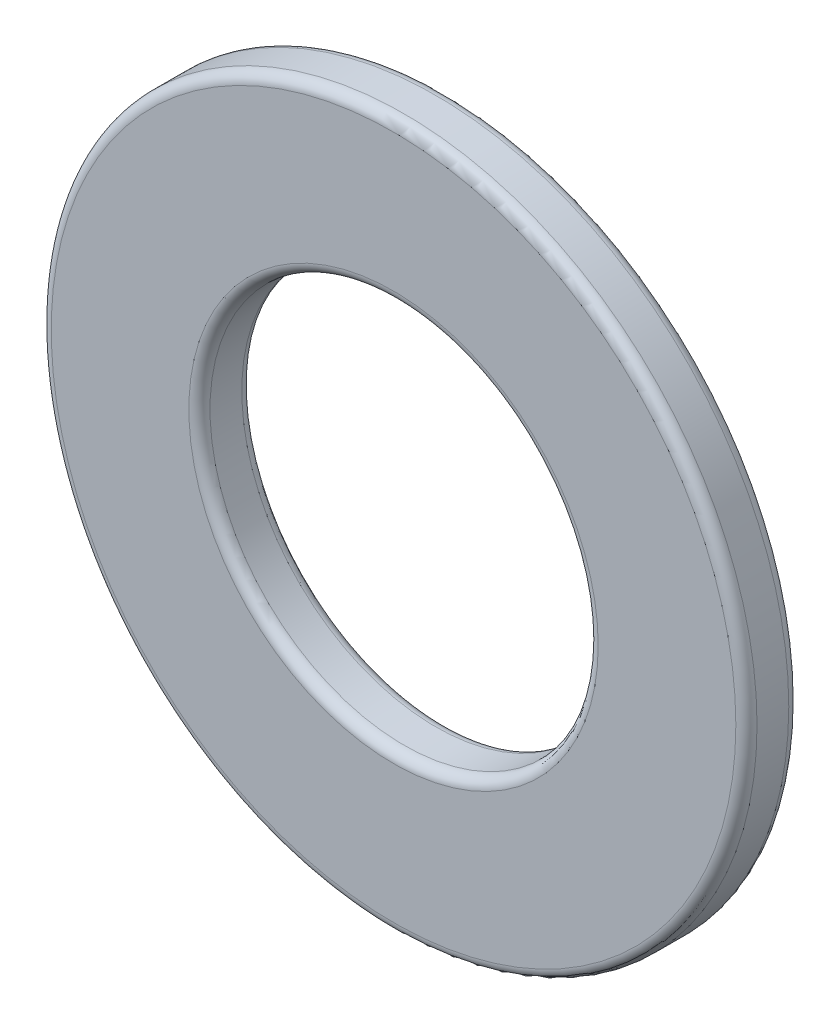
ISO-10303-21;
HEADER;
FILE_DESCRIPTION(('STEP AP214'),'2;1');
FILE_NAME('part.step','',(''),(''),'','','');
FILE_SCHEMA(('AUTOMOTIVE_DESIGN { 1 0 10303 214 1 1 1 1 }'));
ENDSEC;
DATA;
#1=APPLICATION_CONTEXT('core data for automotive mechanical design processes');
#2=APPLICATION_PROTOCOL_DEFINITION('international standard','automotive_design',2000,#1);
#3=PRODUCT_CONTEXT('',#1,'mechanical');
#4=PRODUCT('Part','Part','',(#3));
#5=PRODUCT_RELATED_PRODUCT_CATEGORY('part','',(#4));
#6=PRODUCT_DEFINITION_FORMATION('','',#4);
#7=PRODUCT_DEFINITION_CONTEXT('part definition',#1,'design');
#8=PRODUCT_DEFINITION('design','',#6,#7);
#9=PRODUCT_DEFINITION_SHAPE('','',#8);
#10=(LENGTH_UNIT() NAMED_UNIT(*) SI_UNIT(.MILLI.,.METRE.));
#11=(NAMED_UNIT(*) PLANE_ANGLE_UNIT() SI_UNIT($,.RADIAN.));
#12=(NAMED_UNIT(*) SI_UNIT($,.STERADIAN.) SOLID_ANGLE_UNIT());
#13=UNCERTAINTY_MEASURE_WITH_UNIT(LENGTH_MEASURE(1.E-05),#10,'distance_accuracy_value','');
#14=(GEOMETRIC_REPRESENTATION_CONTEXT(3) GLOBAL_UNCERTAINTY_ASSIGNED_CONTEXT((#13)) GLOBAL_UNIT_ASSIGNED_CONTEXT((#10,
#11,#12)) REPRESENTATION_CONTEXT('',''));
#15=CARTESIAN_POINT('',(0.,0.,0.));
#16=DIRECTION('',(0.,0.,1.));
#17=DIRECTION('',(1.,0.,0.));
#18=AXIS2_PLACEMENT_3D('',#15,#16,#17);
#19=CARTESIAN_POINT('',(0.,0.,-0.15));
#20=DIRECTION('',(0.,0.,1.));
#21=DIRECTION('',(1.,0.,0.));
#22=AXIS2_PLACEMENT_3D('',#19,#20,#21);
#23=CYLINDRICAL_SURFACE('',#22,2.);
#24=CARTESIAN_POINT('',(0.,0.,0.0899999999999999));
#25=DIRECTION('',(0.,0.,1.));
#26=DIRECTION('',(1.,0.,0.));
#27=AXIS2_PLACEMENT_3D('',#24,#25,#26);
#28=CIRCLE('',#27,2.);
#29=CARTESIAN_POINT('',(2.,0.,0.0899999999999999));
#30=VERTEX_POINT('',#29);
#31=EDGE_CURVE('E56',#30,#30,#28,.F.);
#32=ORIENTED_EDGE('',*,*,#31,.T.);
#33=EDGE_LOOP('',(#32));
#34=FACE_BOUND('',#33,.T.);
#35=CARTESIAN_POINT('',(0.,0.,-0.0900000000000001));
#36=DIRECTION('',(0.,0.,1.));
#37=DIRECTION('',(1.,0.,0.));
#38=AXIS2_PLACEMENT_3D('',#35,#36,#37);
#39=CIRCLE('',#38,2.);
#40=CARTESIAN_POINT('',(2.,0.,-0.0900000000000001));
#41=VERTEX_POINT('',#40);
#42=EDGE_CURVE('E59',#41,#41,#39,.T.);
#43=ORIENTED_EDGE('',*,*,#42,.T.);
#44=EDGE_LOOP('',(#43));
#45=FACE_BOUND('',#44,.T.);
#46=ADVANCED_FACE('F36',(#34,#45),#23,.T.);
#47=CARTESIAN_POINT('',(0.,0.,-0.15));
#48=DIRECTION('',(0.,0.,1.));
#49=DIRECTION('',(1.,0.,0.));
#50=AXIS2_PLACEMENT_3D('',#47,#48,#49);
#51=PLANE('',#50);
#52=CARTESIAN_POINT('',(0.,0.,-0.15));
#53=DIRECTION('',(0.,0.,1.));
#54=DIRECTION('',(1.,0.,0.));
#55=AXIS2_PLACEMENT_3D('',#52,#53,#54);
#56=CIRCLE('',#55,1.94);
#57=CARTESIAN_POINT('',(1.94,0.,-0.15));
#58=VERTEX_POINT('',#57);
#59=EDGE_CURVE('E47',#58,#58,#56,.F.);
#60=ORIENTED_EDGE('',*,*,#59,.T.);
#61=EDGE_LOOP('',(#60));
#62=FACE_BOUND('',#61,.T.);
#63=CARTESIAN_POINT('',(0.,0.,-0.15));
#64=DIRECTION('',(0.,0.,1.));
#65=DIRECTION('',(1.,0.,0.));
#66=AXIS2_PLACEMENT_3D('',#63,#64,#65);
#67=CIRCLE('',#66,1.16);
#68=CARTESIAN_POINT('',(1.16,0.,-0.15));
#69=VERTEX_POINT('',#68);
#70=EDGE_CURVE('E51',#69,#69,#67,.T.);
#71=ORIENTED_EDGE('',*,*,#70,.T.);
#72=EDGE_LOOP('',(#71));
#73=FACE_BOUND('',#72,.T.);
#74=ADVANCED_FACE('F84',(#62,#73),#51,.F.);
#75=CARTESIAN_POINT('',(0.,0.,0.15));
#76=DIRECTION('',(0.,0.,1.));
#77=DIRECTION('',(1.,0.,0.));
#78=AXIS2_PLACEMENT_3D('',#75,#76,#77);
#79=PLANE('',#78);
#80=CARTESIAN_POINT('',(0.,0.,0.15));
#81=DIRECTION('',(0.,0.,1.));
#82=DIRECTION('',(1.,0.,0.));
#83=AXIS2_PLACEMENT_3D('',#80,#81,#82);
#84=CIRCLE('',#83,1.94);
#85=CARTESIAN_POINT('',(1.94,0.,0.15));
#86=VERTEX_POINT('',#85);
#87=EDGE_CURVE('E62',#86,#86,#84,.T.);
#88=ORIENTED_EDGE('',*,*,#87,.T.);
#89=EDGE_LOOP('',(#88));
#90=FACE_BOUND('',#89,.T.);
#91=CARTESIAN_POINT('',(0.,0.,0.15));
#92=DIRECTION('',(0.,0.,1.));
#93=DIRECTION('',(1.,0.,0.));
#94=AXIS2_PLACEMENT_3D('',#91,#92,#93);
#95=CIRCLE('',#94,1.16);
#96=CARTESIAN_POINT('',(1.16,0.,0.15));
#97=VERTEX_POINT('',#96);
#98=EDGE_CURVE('E65',#97,#97,#95,.F.);
#99=ORIENTED_EDGE('',*,*,#98,.T.);
#100=EDGE_LOOP('',(#99));
#101=FACE_BOUND('',#100,.T.);
#102=ADVANCED_FACE('F69',(#90,#101),#79,.T.);
#103=CARTESIAN_POINT('',(0.,0.,-0.15));
#104=DIRECTION('',(0.,0.,1.));
#105=DIRECTION('',(1.,0.,0.));
#106=AXIS2_PLACEMENT_3D('',#103,#104,#105);
#107=CYLINDRICAL_SURFACE('',#106,1.1);
#108=CARTESIAN_POINT('',(0.,0.,0.0899999999999999));
#109=DIRECTION('',(0.,0.,1.));
#110=DIRECTION('',(1.,0.,0.));
#111=AXIS2_PLACEMENT_3D('',#108,#109,#110);
#112=CIRCLE('',#111,1.1);
#113=CARTESIAN_POINT('',(1.1,0.,0.0899999999999999));
#114=VERTEX_POINT('',#113);
#115=EDGE_CURVE('E10',#114,#114,#112,.T.);
#116=ORIENTED_EDGE('',*,*,#115,.T.);
#117=EDGE_LOOP('',(#116));
#118=FACE_BOUND('',#117,.T.);
#119=CARTESIAN_POINT('',(0.,0.,-0.0900000000000001));
#120=DIRECTION('',(0.,0.,1.));
#121=DIRECTION('',(1.,0.,0.));
#122=AXIS2_PLACEMENT_3D('',#119,#120,#121);
#123=CIRCLE('',#122,1.1);
#124=CARTESIAN_POINT('',(1.1,0.,-0.0900000000000001));
#125=VERTEX_POINT('',#124);
#126=EDGE_CURVE('E43',#125,#125,#123,.F.);
#127=ORIENTED_EDGE('',*,*,#126,.T.);
#128=EDGE_LOOP('',(#127));
#129=FACE_BOUND('',#128,.T.);
#130=ADVANCED_FACE('F96',(#118,#129),#107,.F.);
#131=CARTESIAN_POINT('',(0.,0.,0.0899999999999999));
#132=DIRECTION('',(0.,0.,1.));
#133=DIRECTION('',(1.,0.,0.));
#134=AXIS2_PLACEMENT_3D('',#131,#132,#133);
#135=TOROIDAL_SURFACE('',#134,1.94,0.06);
#136=ORIENTED_EDGE('',*,*,#31,.F.);
#137=EDGE_LOOP('',(#136));
#138=FACE_BOUND('',#137,.T.);
#139=ORIENTED_EDGE('',*,*,#87,.F.);
#140=EDGE_LOOP('',(#139));
#141=FACE_BOUND('',#140,.T.);
#142=ADVANCED_FACE('F80',(#138,#141),#135,.T.);
#143=CARTESIAN_POINT('',(0.,0.,-0.0900000000000001));
#144=DIRECTION('',(0.,0.,1.));
#145=DIRECTION('',(1.,0.,0.));
#146=AXIS2_PLACEMENT_3D('',#143,#144,#145);
#147=TOROIDAL_SURFACE('',#146,1.94,0.06);
#148=ORIENTED_EDGE('',*,*,#59,.F.);
#149=EDGE_LOOP('',(#148));
#150=FACE_BOUND('',#149,.T.);
#151=ORIENTED_EDGE('',*,*,#42,.F.);
#152=EDGE_LOOP('',(#151));
#153=FACE_BOUND('',#152,.T.);
#154=ADVANCED_FACE('F74',(#150,#153),#147,.T.);
#155=CARTESIAN_POINT('',(0.,0.,0.0899999999999999));
#156=DIRECTION('',(0.,0.,1.));
#157=DIRECTION('',(1.,0.,0.));
#158=AXIS2_PLACEMENT_3D('',#155,#156,#157);
#159=TOROIDAL_SURFACE('',#158,1.16,0.06);
#160=ORIENTED_EDGE('',*,*,#98,.F.);
#161=EDGE_LOOP('',(#160));
#162=FACE_BOUND('',#161,.T.);
#163=ORIENTED_EDGE('',*,*,#115,.F.);
#164=EDGE_LOOP('',(#163));
#165=FACE_BOUND('',#164,.T.);
#166=ADVANCED_FACE('F71',(#162,#165),#159,.T.);
#167=CARTESIAN_POINT('',(0.,0.,-0.0900000000000001));
#168=DIRECTION('',(0.,0.,1.));
#169=DIRECTION('',(1.,0.,0.));
#170=AXIS2_PLACEMENT_3D('',#167,#168,#169);
#171=TOROIDAL_SURFACE('',#170,1.16,0.06);
#172=ORIENTED_EDGE('',*,*,#126,.F.);
#173=EDGE_LOOP('',(#172));
#174=FACE_BOUND('',#173,.T.);
#175=ORIENTED_EDGE('',*,*,#70,.F.);
#176=EDGE_LOOP('',(#175));
#177=FACE_BOUND('',#176,.T.);
#178=ADVANCED_FACE('F38',(#174,#177),#171,.T.);
#179=CLOSED_SHELL('',(#46,#74,#102,#130,#142,#154,#166,#178));
#180=MANIFOLD_SOLID_BREP('B2',#179);
#181=ADVANCED_BREP_SHAPE_REPRESENTATION('',(#18,#180),#14);
#182=SHAPE_DEFINITION_REPRESENTATION(#9,#181);
ENDSEC;
END-ISO-10303-21;
